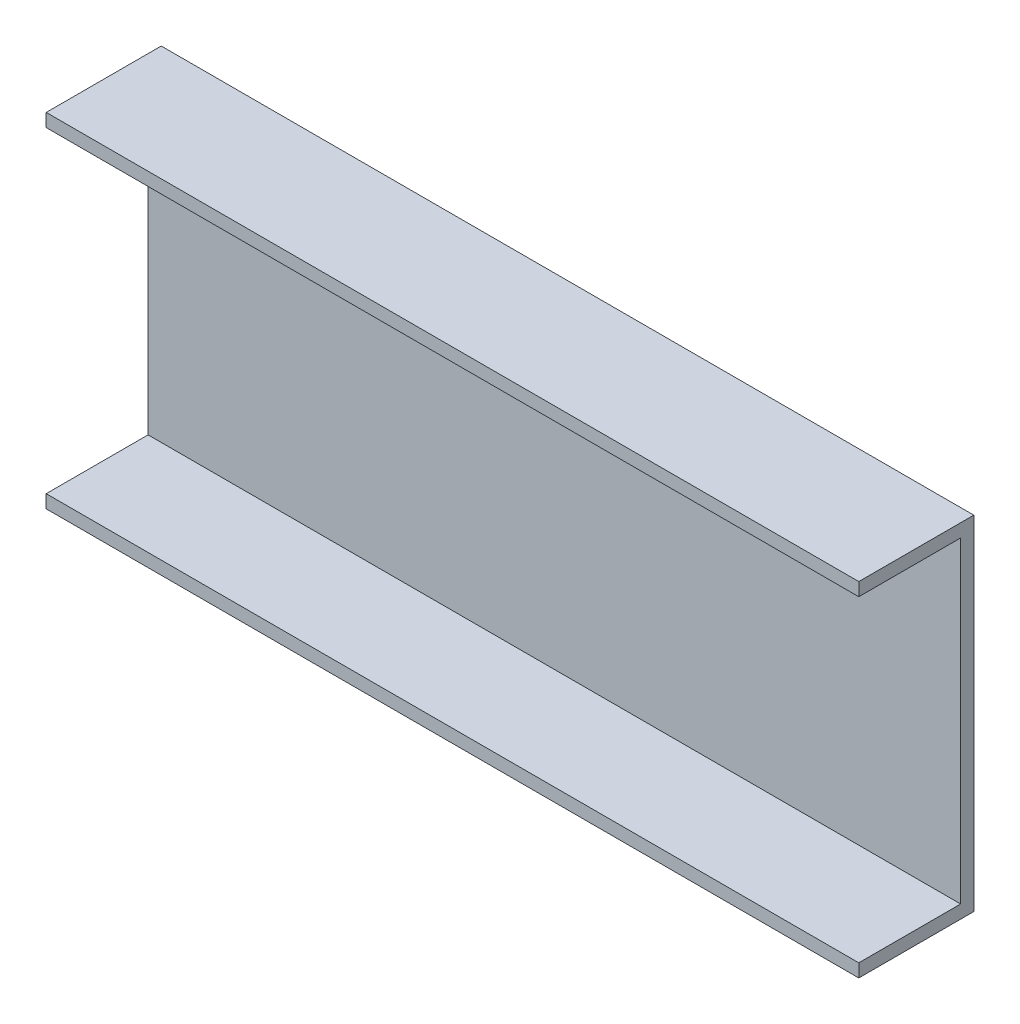
ISO-10303-21;
HEADER;
FILE_DESCRIPTION(('STEP AP214'),'2;1');
FILE_NAME('part.step','',(''),(''),'','','');
FILE_SCHEMA(('AUTOMOTIVE_DESIGN { 1 0 10303 214 1 1 1 1 }'));
ENDSEC;
DATA;
#1=APPLICATION_CONTEXT('core data for automotive mechanical design processes');
#2=APPLICATION_PROTOCOL_DEFINITION('international standard','automotive_design',2000,#1);
#3=PRODUCT_CONTEXT('',#1,'mechanical');
#4=PRODUCT('Part','Part','',(#3));
#5=PRODUCT_RELATED_PRODUCT_CATEGORY('part','',(#4));
#6=PRODUCT_DEFINITION_FORMATION('','',#4);
#7=PRODUCT_DEFINITION_CONTEXT('part definition',#1,'design');
#8=PRODUCT_DEFINITION('design','',#6,#7);
#9=PRODUCT_DEFINITION_SHAPE('','',#8);
#10=(LENGTH_UNIT() NAMED_UNIT(*) SI_UNIT(.MILLI.,.METRE.));
#11=(NAMED_UNIT(*) PLANE_ANGLE_UNIT() SI_UNIT($,.RADIAN.));
#12=(NAMED_UNIT(*) SI_UNIT($,.STERADIAN.) SOLID_ANGLE_UNIT());
#13=UNCERTAINTY_MEASURE_WITH_UNIT(LENGTH_MEASURE(1.E-05),#10,'distance_accuracy_value','');
#14=(GEOMETRIC_REPRESENTATION_CONTEXT(3) GLOBAL_UNCERTAINTY_ASSIGNED_CONTEXT((#13)) GLOBAL_UNIT_ASSIGNED_CONTEXT((#10,
#11,#12)) REPRESENTATION_CONTEXT('',''));
#15=CARTESIAN_POINT('',(0.,0.,0.));
#16=DIRECTION('',(0.,0.,1.));
#17=DIRECTION('',(1.,0.,0.));
#18=AXIS2_PLACEMENT_3D('',#15,#16,#17);
#19=CARTESIAN_POINT('',(355.,150.,11.5));
#20=DIRECTION('',(-1.,0.,0.));
#21=DIRECTION('',(0.,-1.,0.));
#22=AXIS2_PLACEMENT_3D('',#19,#20,#21);
#23=PLANE('',#22);
#24=DIRECTION('',(0.,1.,0.));
#25=VECTOR('',#24,1.);
#26=CARTESIAN_POINT('',(355.,150.,0.));
#27=LINE('',#26,#25);
#28=CARTESIAN_POINT('',(355.,-150.,0.));
#29=VERTEX_POINT('',#28);
#30=CARTESIAN_POINT('',(355.,150.,0.));
#31=VERTEX_POINT('',#30);
#32=EDGE_CURVE('E161',#29,#31,#27,.T.);
#33=ORIENTED_EDGE('',*,*,#32,.T.);
#34=DIRECTION('',(0.,0.,-1.));
#35=VECTOR('',#34,1.);
#36=CARTESIAN_POINT('',(355.,150.,11.5));
#37=LINE('',#36,#35);
#38=CARTESIAN_POINT('',(355.,150.,100.5));
#39=VERTEX_POINT('',#38);
#40=EDGE_CURVE('E11',#39,#31,#37,.T.);
#41=ORIENTED_EDGE('',*,*,#40,.F.);
#42=DIRECTION('',(0.,1.,0.));
#43=VECTOR('',#42,1.);
#44=CARTESIAN_POINT('',(355.,138.5,100.5));
#45=LINE('',#44,#43);
#46=CARTESIAN_POINT('',(355.,138.5,100.5));
#47=VERTEX_POINT('',#46);
#48=EDGE_CURVE('E141',#47,#39,#45,.T.);
#49=ORIENTED_EDGE('',*,*,#48,.F.);
#50=DIRECTION('',(0.,0.,-1.));
#51=VECTOR('',#50,1.);
#52=CARTESIAN_POINT('',(355.,138.5,100.5));
#53=LINE('',#52,#51);
#54=CARTESIAN_POINT('',(355.,138.5,11.5));
#55=VERTEX_POINT('',#54);
#56=EDGE_CURVE('E147',#47,#55,#53,.T.);
#57=ORIENTED_EDGE('',*,*,#56,.T.);
#58=DIRECTION('',(0.,1.,0.));
#59=VECTOR('',#58,1.);
#60=CARTESIAN_POINT('',(355.,150.,11.5));
#61=LINE('',#60,#59);
#62=CARTESIAN_POINT('',(355.,-138.5,11.5));
#63=VERTEX_POINT('',#62);
#64=EDGE_CURVE('E37',#63,#55,#61,.T.);
#65=ORIENTED_EDGE('',*,*,#64,.F.);
#66=DIRECTION('',(0.,0.,-1.));
#67=VECTOR('',#66,1.);
#68=CARTESIAN_POINT('',(355.,-138.5,100.5));
#69=LINE('',#68,#67);
#70=CARTESIAN_POINT('',(355.,-138.5,100.5));
#71=VERTEX_POINT('',#70);
#72=EDGE_CURVE('E133',#71,#63,#69,.T.);
#73=ORIENTED_EDGE('',*,*,#72,.F.);
#74=DIRECTION('',(0.,-1.,0.));
#75=VECTOR('',#74,1.);
#76=CARTESIAN_POINT('',(355.,-138.5,100.5));
#77=LINE('',#76,#75);
#78=CARTESIAN_POINT('',(355.,-150.,100.5));
#79=VERTEX_POINT('',#78);
#80=EDGE_CURVE('E125',#71,#79,#77,.T.);
#81=ORIENTED_EDGE('',*,*,#80,.T.);
#82=DIRECTION('',(0.,0.,-1.));
#83=VECTOR('',#82,1.);
#84=CARTESIAN_POINT('',(355.,-150.,11.5));
#85=LINE('',#84,#83);
#86=EDGE_CURVE('E112',#79,#29,#85,.T.);
#87=ORIENTED_EDGE('',*,*,#86,.T.);
#88=EDGE_LOOP('',(#33,#41,#49,#57,#65,#73,#81,#87));
#89=FACE_BOUND('',#88,.T.);
#90=ADVANCED_FACE('F34',(#89),#23,.F.);
#91=CARTESIAN_POINT('',(-355.,150.,11.5));
#92=DIRECTION('',(0.,-1.,0.));
#93=DIRECTION('',(0.,0.,-1.));
#94=AXIS2_PLACEMENT_3D('',#91,#92,#93);
#95=PLANE('',#94);
#96=DIRECTION('',(-1.,0.,0.));
#97=VECTOR('',#96,1.);
#98=CARTESIAN_POINT('',(-355.,150.,0.));
#99=LINE('',#98,#97);
#100=CARTESIAN_POINT('',(-355.,150.,0.));
#101=VERTEX_POINT('',#100);
#102=EDGE_CURVE('E166',#31,#101,#99,.T.);
#103=ORIENTED_EDGE('',*,*,#102,.T.);
#104=DIRECTION('',(0.,0.,-1.));
#105=VECTOR('',#104,1.);
#106=CARTESIAN_POINT('',(-355.,150.,11.5));
#107=LINE('',#106,#105);
#108=CARTESIAN_POINT('',(-355.,150.,100.5));
#109=VERTEX_POINT('',#108);
#110=EDGE_CURVE('E43',#109,#101,#107,.T.);
#111=ORIENTED_EDGE('',*,*,#110,.F.);
#112=DIRECTION('',(-1.,0.,0.));
#113=VECTOR('',#112,1.);
#114=CARTESIAN_POINT('',(355.,150.,100.5));
#115=LINE('',#114,#113);
#116=EDGE_CURVE('E144',#39,#109,#115,.T.);
#117=ORIENTED_EDGE('',*,*,#116,.F.);
#118=ORIENTED_EDGE('',*,*,#40,.T.);
#119=EDGE_LOOP('',(#103,#111,#117,#118));
#120=FACE_BOUND('',#119,.T.);
#121=ADVANCED_FACE('F190',(#120),#95,.F.);
#122=CARTESIAN_POINT('',(-355.,150.,11.5));
#123=DIRECTION('',(1.,0.,0.));
#124=DIRECTION('',(0.,1.,0.));
#125=AXIS2_PLACEMENT_3D('',#122,#123,#124);
#126=PLANE('',#125);
#127=DIRECTION('',(0.,-1.,0.));
#128=VECTOR('',#127,1.);
#129=CARTESIAN_POINT('',(-355.,150.,0.));
#130=LINE('',#129,#128);
#131=CARTESIAN_POINT('',(-355.,-150.,0.));
#132=VERTEX_POINT('',#131);
#133=EDGE_CURVE('E108',#101,#132,#130,.T.);
#134=ORIENTED_EDGE('',*,*,#133,.T.);
#135=DIRECTION('',(0.,0.,-1.));
#136=VECTOR('',#135,1.);
#137=CARTESIAN_POINT('',(-355.,-150.,11.5));
#138=LINE('',#137,#136);
#139=CARTESIAN_POINT('',(-355.,-150.,100.5));
#140=VERTEX_POINT('',#139);
#141=EDGE_CURVE('E100',#140,#132,#138,.T.);
#142=ORIENTED_EDGE('',*,*,#141,.F.);
#143=DIRECTION('',(0.,1.,0.));
#144=VECTOR('',#143,1.);
#145=CARTESIAN_POINT('',(-355.,-150.,100.5));
#146=LINE('',#145,#144);
#147=CARTESIAN_POINT('',(-355.,-138.5,100.5));
#148=VERTEX_POINT('',#147);
#149=EDGE_CURVE('E104',#140,#148,#146,.T.);
#150=ORIENTED_EDGE('',*,*,#149,.T.);
#151=DIRECTION('',(0.,0.,-1.));
#152=VECTOR('',#151,1.);
#153=CARTESIAN_POINT('',(-355.,-138.5,100.5));
#154=LINE('',#153,#152);
#155=CARTESIAN_POINT('',(-355.,-138.5,11.5));
#156=VERTEX_POINT('',#155);
#157=EDGE_CURVE('E130',#148,#156,#154,.T.);
#158=ORIENTED_EDGE('',*,*,#157,.T.);
#159=DIRECTION('',(0.,-1.,0.));
#160=VECTOR('',#159,1.);
#161=CARTESIAN_POINT('',(-355.,150.,11.5));
#162=LINE('',#161,#160);
#163=CARTESIAN_POINT('',(-355.,138.5,11.5));
#164=VERTEX_POINT('',#163);
#165=EDGE_CURVE('E154',#164,#156,#162,.T.);
#166=ORIENTED_EDGE('',*,*,#165,.F.);
#167=DIRECTION('',(0.,0.,-1.));
#168=VECTOR('',#167,1.);
#169=CARTESIAN_POINT('',(-355.,138.5,100.5));
#170=LINE('',#169,#168);
#171=CARTESIAN_POINT('',(-355.,138.5,100.5));
#172=VERTEX_POINT('',#171);
#173=EDGE_CURVE('E157',#172,#164,#170,.T.);
#174=ORIENTED_EDGE('',*,*,#173,.F.);
#175=DIRECTION('',(0.,-1.,0.));
#176=VECTOR('',#175,1.);
#177=CARTESIAN_POINT('',(-355.,150.,100.5));
#178=LINE('',#177,#176);
#179=EDGE_CURVE('E136',#109,#172,#178,.T.);
#180=ORIENTED_EDGE('',*,*,#179,.F.);
#181=ORIENTED_EDGE('',*,*,#110,.T.);
#182=EDGE_LOOP('',(#134,#142,#150,#158,#166,#174,#180,#181));
#183=FACE_BOUND('',#182,.T.);
#184=ADVANCED_FACE('F102',(#183),#126,.F.);
#185=CARTESIAN_POINT('',(-355.,-150.,11.5));
#186=DIRECTION('',(0.,1.,0.));
#187=DIRECTION('',(0.,0.,1.));
#188=AXIS2_PLACEMENT_3D('',#185,#186,#187);
#189=PLANE('',#188);
#190=DIRECTION('',(1.,0.,0.));
#191=VECTOR('',#190,1.);
#192=CARTESIAN_POINT('',(-355.,-150.,0.));
#193=LINE('',#192,#191);
#194=EDGE_CURVE('E174',#132,#29,#193,.T.);
#195=ORIENTED_EDGE('',*,*,#194,.T.);
#196=ORIENTED_EDGE('',*,*,#86,.F.);
#197=DIRECTION('',(-1.,0.,0.));
#198=VECTOR('',#197,1.);
#199=CARTESIAN_POINT('',(355.,-150.,100.5));
#200=LINE('',#199,#198);
#201=EDGE_CURVE('E118',#79,#140,#200,.T.);
#202=ORIENTED_EDGE('',*,*,#201,.T.);
#203=ORIENTED_EDGE('',*,*,#141,.T.);
#204=EDGE_LOOP('',(#195,#196,#202,#203));
#205=FACE_BOUND('',#204,.T.);
#206=ADVANCED_FACE('F123',(#205),#189,.F.);
#207=CARTESIAN_POINT('',(355.,-150.,11.5));
#208=DIRECTION('',(0.,0.,1.));
#209=DIRECTION('',(1.,0.,0.));
#210=AXIS2_PLACEMENT_3D('',#207,#208,#209);
#211=PLANE('',#210);
#212=DIRECTION('',(1.,0.,0.));
#213=VECTOR('',#212,1.);
#214=CARTESIAN_POINT('',(-355.,-138.5,11.5));
#215=LINE('',#214,#213);
#216=EDGE_CURVE('E51',#156,#63,#215,.T.);
#217=ORIENTED_EDGE('',*,*,#216,.T.);
#218=ORIENTED_EDGE('',*,*,#64,.T.);
#219=DIRECTION('',(1.,0.,0.));
#220=VECTOR('',#219,1.);
#221=CARTESIAN_POINT('',(-355.,138.5,11.5));
#222=LINE('',#221,#220);
#223=EDGE_CURVE('E56',#164,#55,#222,.T.);
#224=ORIENTED_EDGE('',*,*,#223,.F.);
#225=ORIENTED_EDGE('',*,*,#165,.T.);
#226=EDGE_LOOP('',(#217,#218,#224,#225));
#227=FACE_BOUND('',#226,.T.);
#228=ADVANCED_FACE('F184',(#227),#211,.T.);
#229=CARTESIAN_POINT('',(355.,-150.,0.));
#230=DIRECTION('',(0.,0.,1.));
#231=DIRECTION('',(1.,0.,0.));
#232=AXIS2_PLACEMENT_3D('',#229,#230,#231);
#233=PLANE('',#232);
#234=ORIENTED_EDGE('',*,*,#32,.F.);
#235=ORIENTED_EDGE('',*,*,#194,.F.);
#236=ORIENTED_EDGE('',*,*,#133,.F.);
#237=ORIENTED_EDGE('',*,*,#102,.F.);
#238=EDGE_LOOP('',(#234,#235,#236,#237));
#239=FACE_BOUND('',#238,.T.);
#240=ADVANCED_FACE('F181',(#239),#233,.F.);
#241=CARTESIAN_POINT('',(-355.,138.5,100.5));
#242=DIRECTION('',(0.,1.,0.));
#243=DIRECTION('',(0.,0.,1.));
#244=AXIS2_PLACEMENT_3D('',#241,#242,#243);
#245=PLANE('',#244);
#246=ORIENTED_EDGE('',*,*,#223,.T.);
#247=ORIENTED_EDGE('',*,*,#56,.F.);
#248=DIRECTION('',(1.,0.,0.));
#249=VECTOR('',#248,1.);
#250=CARTESIAN_POINT('',(-355.,138.5,100.5));
#251=LINE('',#250,#249);
#252=EDGE_CURVE('E139',#172,#47,#251,.T.);
#253=ORIENTED_EDGE('',*,*,#252,.F.);
#254=ORIENTED_EDGE('',*,*,#173,.T.);
#255=EDGE_LOOP('',(#246,#247,#253,#254));
#256=FACE_BOUND('',#255,.T.);
#257=ADVANCED_FACE('F186',(#256),#245,.F.);
#258=CARTESIAN_POINT('',(-355.,138.5,100.5));
#259=DIRECTION('',(0.,0.,1.));
#260=DIRECTION('',(1.,0.,0.));
#261=AXIS2_PLACEMENT_3D('',#258,#259,#260);
#262=PLANE('',#261);
#263=ORIENTED_EDGE('',*,*,#179,.T.);
#264=ORIENTED_EDGE('',*,*,#252,.T.);
#265=ORIENTED_EDGE('',*,*,#48,.T.);
#266=ORIENTED_EDGE('',*,*,#116,.T.);
#267=EDGE_LOOP('',(#263,#264,#265,#266));
#268=FACE_BOUND('',#267,.T.);
#269=ADVANCED_FACE('F189',(#268),#262,.T.);
#270=CARTESIAN_POINT('',(-355.,-138.5,100.5));
#271=DIRECTION('',(0.,1.,0.));
#272=DIRECTION('',(0.,0.,1.));
#273=AXIS2_PLACEMENT_3D('',#270,#271,#272);
#274=PLANE('',#273);
#275=ORIENTED_EDGE('',*,*,#216,.F.);
#276=ORIENTED_EDGE('',*,*,#157,.F.);
#277=DIRECTION('',(1.,0.,0.));
#278=VECTOR('',#277,1.);
#279=CARTESIAN_POINT('',(-355.,-138.5,100.5));
#280=LINE('',#279,#278);
#281=EDGE_CURVE('E121',#148,#71,#280,.T.);
#282=ORIENTED_EDGE('',*,*,#281,.T.);
#283=ORIENTED_EDGE('',*,*,#72,.T.);
#284=EDGE_LOOP('',(#275,#276,#282,#283));
#285=FACE_BOUND('',#284,.T.);
#286=ADVANCED_FACE('F183',(#285),#274,.T.);
#287=CARTESIAN_POINT('',(-355.,-138.5,100.5));
#288=DIRECTION('',(0.,0.,1.));
#289=DIRECTION('',(1.,0.,0.));
#290=AXIS2_PLACEMENT_3D('',#287,#288,#289);
#291=PLANE('',#290);
#292=ORIENTED_EDGE('',*,*,#149,.F.);
#293=ORIENTED_EDGE('',*,*,#201,.F.);
#294=ORIENTED_EDGE('',*,*,#80,.F.);
#295=ORIENTED_EDGE('',*,*,#281,.F.);
#296=EDGE_LOOP('',(#292,#293,#294,#295));
#297=FACE_BOUND('',#296,.T.);
#298=ADVANCED_FACE('F116',(#297),#291,.T.);
#299=CLOSED_SHELL('',(#90,#121,#184,#206,#228,#240,#257,#269,#286,#298));
#300=MANIFOLD_SOLID_BREP('B2',#299);
#301=ADVANCED_BREP_SHAPE_REPRESENTATION('',(#18,#300),#14);
#302=SHAPE_DEFINITION_REPRESENTATION(#9,#301);
ENDSEC;
END-ISO-10303-21;
